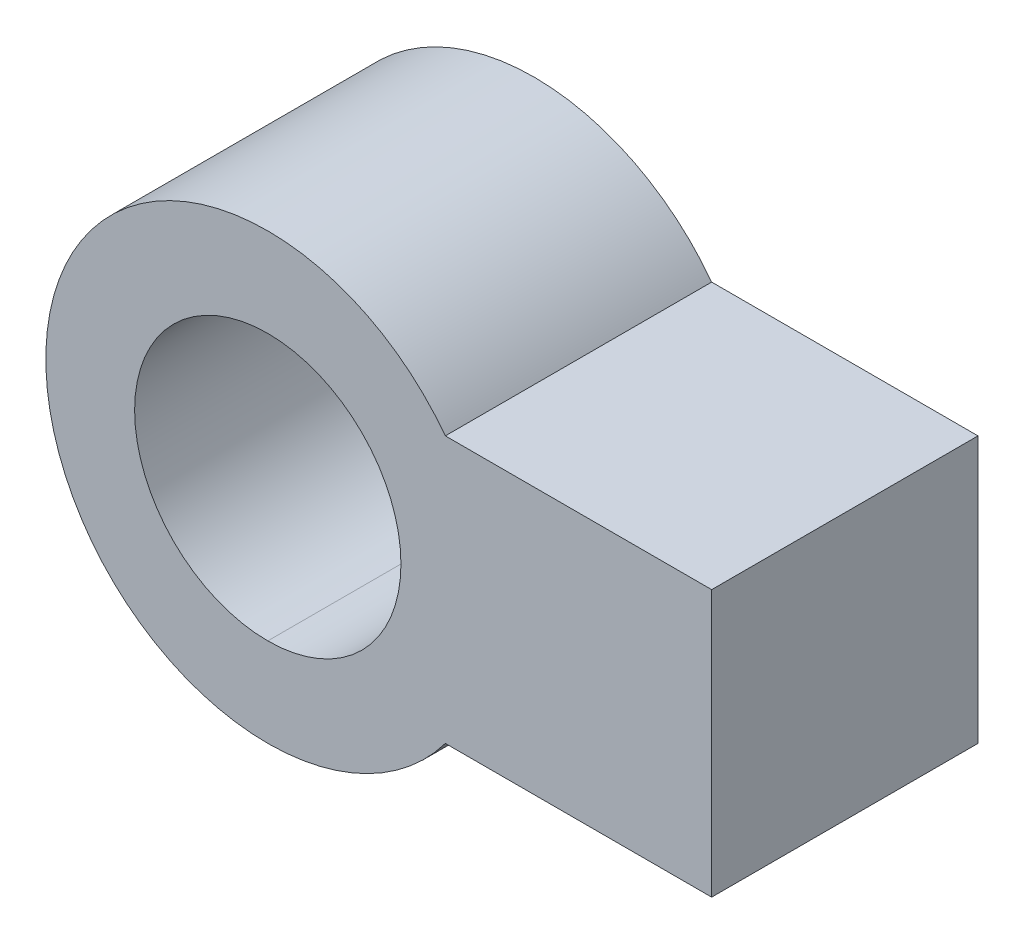
ISO-10303-21;
HEADER;
FILE_DESCRIPTION(('STEP AP214'),'2;1');
FILE_NAME('part.step','',(''),(''),'','','');
FILE_SCHEMA(('AUTOMOTIVE_DESIGN { 1 0 10303 214 1 1 1 1 }'));
ENDSEC;
DATA;
#1=APPLICATION_CONTEXT('core data for automotive mechanical design processes');
#2=APPLICATION_PROTOCOL_DEFINITION('international standard','automotive_design',2000,#1);
#3=PRODUCT_CONTEXT('',#1,'mechanical');
#4=PRODUCT('Part','Part','',(#3));
#5=PRODUCT_RELATED_PRODUCT_CATEGORY('part','',(#4));
#6=PRODUCT_DEFINITION_FORMATION('','',#4);
#7=PRODUCT_DEFINITION_CONTEXT('part definition',#1,'design');
#8=PRODUCT_DEFINITION('design','',#6,#7);
#9=PRODUCT_DEFINITION_SHAPE('','',#8);
#10=(LENGTH_UNIT() NAMED_UNIT(*) SI_UNIT(.MILLI.,.METRE.));
#11=(NAMED_UNIT(*) PLANE_ANGLE_UNIT() SI_UNIT($,.RADIAN.));
#12=(NAMED_UNIT(*) SI_UNIT($,.STERADIAN.) SOLID_ANGLE_UNIT());
#13=UNCERTAINTY_MEASURE_WITH_UNIT(LENGTH_MEASURE(1.E-05),#10,'distance_accuracy_value','');
#14=(GEOMETRIC_REPRESENTATION_CONTEXT(3) GLOBAL_UNCERTAINTY_ASSIGNED_CONTEXT((#13)) GLOBAL_UNIT_ASSIGNED_CONTEXT((#10,
#11,#12)) REPRESENTATION_CONTEXT('',''));
#15=CARTESIAN_POINT('',(0.,0.,0.));
#16=DIRECTION('',(0.,0.,1.));
#17=DIRECTION('',(1.,0.,0.));
#18=AXIS2_PLACEMENT_3D('',#15,#16,#17);
#19=CARTESIAN_POINT('',(0.,0.,6.));
#20=DIRECTION('',(0.,0.,1.));
#21=DIRECTION('',(1.,0.,0.));
#22=AXIS2_PLACEMENT_3D('',#19,#20,#21);
#23=PLANE('',#22);
#24=CARTESIAN_POINT('',(0.,0.,6.));
#25=DIRECTION('',(0.,0.,1.));
#26=DIRECTION('',(1.,0.,0.));
#27=AXIS2_PLACEMENT_3D('',#24,#25,#26);
#28=CIRCLE('',#27,5.);
#29=CARTESIAN_POINT('',(4.,3.,6.));
#30=VERTEX_POINT('',#29);
#31=CARTESIAN_POINT('',(4.,-3.,6.));
#32=VERTEX_POINT('',#31);
#33=EDGE_CURVE('E159',#30,#32,#28,.T.);
#34=ORIENTED_EDGE('',*,*,#33,.T.);
#35=DIRECTION('',(1.,0.,0.));
#36=VECTOR('',#35,1.);
#37=CARTESIAN_POINT('',(0.,-3.,6.));
#38=LINE('',#37,#36);
#39=CARTESIAN_POINT('',(10.,-3.,6.));
#40=VERTEX_POINT('',#39);
#41=EDGE_CURVE('E107',#32,#40,#38,.T.);
#42=ORIENTED_EDGE('',*,*,#41,.T.);
#43=DIRECTION('',(0.,1.,0.));
#44=VECTOR('',#43,1.);
#45=CARTESIAN_POINT('',(10.,0.,6.));
#46=LINE('',#45,#44);
#47=CARTESIAN_POINT('',(10.,3.,6.));
#48=VERTEX_POINT('',#47);
#49=EDGE_CURVE('E141',#40,#48,#46,.T.);
#50=ORIENTED_EDGE('',*,*,#49,.T.);
#51=DIRECTION('',(1.,0.,0.));
#52=VECTOR('',#51,1.);
#53=CARTESIAN_POINT('',(0.,3.,6.));
#54=LINE('',#53,#52);
#55=EDGE_CURVE('E135',#30,#48,#54,.T.);
#56=ORIENTED_EDGE('',*,*,#55,.F.);
#57=EDGE_LOOP('',(#34,#42,#50,#56));
#58=FACE_BOUND('',#57,.T.);
#59=CARTESIAN_POINT('',(0.,0.,6.));
#60=DIRECTION('',(0.,0.,1.));
#61=DIRECTION('',(1.,0.,0.));
#62=AXIS2_PLACEMENT_3D('',#59,#60,#61);
#63=CIRCLE('',#62,3.);
#64=CARTESIAN_POINT('',(0.,3.,6.));
#65=VERTEX_POINT('',#64);
#66=CARTESIAN_POINT('',(0.,-3.,6.));
#67=VERTEX_POINT('',#66);
#68=EDGE_CURVE('E128',#65,#67,#63,.T.);
#69=ORIENTED_EDGE('',*,*,#68,.F.);
#70=CARTESIAN_POINT('',(0.,0.,6.));
#71=DIRECTION('',(0.,0.,1.));
#72=DIRECTION('',(1.,0.,0.));
#73=AXIS2_PLACEMENT_3D('',#70,#71,#72);
#74=CIRCLE('',#73,3.);
#75=EDGE_CURVE('E116',#67,#65,#74,.T.);
#76=ORIENTED_EDGE('',*,*,#75,.F.);
#77=EDGE_LOOP('',(#69,#76));
#78=FACE_BOUND('',#77,.T.);
#79=ADVANCED_FACE('F56',(#58,#78),#23,.T.);
#80=CARTESIAN_POINT('',(0.,0.,0.));
#81=DIRECTION('',(0.,0.,1.));
#82=DIRECTION('',(1.,0.,0.));
#83=AXIS2_PLACEMENT_3D('',#80,#81,#82);
#84=PLANE('',#83);
#85=CARTESIAN_POINT('',(0.,0.,0.));
#86=DIRECTION('',(0.,0.,1.));
#87=DIRECTION('',(1.,0.,0.));
#88=AXIS2_PLACEMENT_3D('',#85,#86,#87);
#89=CIRCLE('',#88,5.);
#90=CARTESIAN_POINT('',(4.,3.,0.));
#91=VERTEX_POINT('',#90);
#92=CARTESIAN_POINT('',(4.,-3.,0.));
#93=VERTEX_POINT('',#92);
#94=EDGE_CURVE('E123',#91,#93,#89,.T.);
#95=ORIENTED_EDGE('',*,*,#94,.F.);
#96=DIRECTION('',(1.,0.,0.));
#97=VECTOR('',#96,1.);
#98=CARTESIAN_POINT('',(0.,3.,0.));
#99=LINE('',#98,#97);
#100=CARTESIAN_POINT('',(10.,3.,0.));
#101=VERTEX_POINT('',#100);
#102=EDGE_CURVE('E154',#91,#101,#99,.T.);
#103=ORIENTED_EDGE('',*,*,#102,.T.);
#104=DIRECTION('',(0.,1.,0.));
#105=VECTOR('',#104,1.);
#106=CARTESIAN_POINT('',(10.,0.,0.));
#107=LINE('',#106,#105);
#108=CARTESIAN_POINT('',(10.,-3.,0.));
#109=VERTEX_POINT('',#108);
#110=EDGE_CURVE('E150',#109,#101,#107,.T.);
#111=ORIENTED_EDGE('',*,*,#110,.F.);
#112=DIRECTION('',(1.,0.,0.));
#113=VECTOR('',#112,1.);
#114=CARTESIAN_POINT('',(0.,-3.,0.));
#115=LINE('',#114,#113);
#116=EDGE_CURVE('E147',#93,#109,#115,.T.);
#117=ORIENTED_EDGE('',*,*,#116,.F.);
#118=EDGE_LOOP('',(#95,#103,#111,#117));
#119=FACE_BOUND('',#118,.T.);
#120=CARTESIAN_POINT('',(0.,0.,0.));
#121=DIRECTION('',(0.,0.,1.));
#122=DIRECTION('',(1.,0.,0.));
#123=AXIS2_PLACEMENT_3D('',#120,#121,#122);
#124=CIRCLE('',#123,3.);
#125=CARTESIAN_POINT('',(0.,3.,0.));
#126=VERTEX_POINT('',#125);
#127=CARTESIAN_POINT('',(0.,-3.,0.));
#128=VERTEX_POINT('',#127);
#129=EDGE_CURVE('E12',#126,#128,#124,.F.);
#130=ORIENTED_EDGE('',*,*,#129,.F.);
#131=CARTESIAN_POINT('',(0.,0.,0.));
#132=DIRECTION('',(0.,0.,1.));
#133=DIRECTION('',(1.,0.,0.));
#134=AXIS2_PLACEMENT_3D('',#131,#132,#133);
#135=CIRCLE('',#134,3.);
#136=EDGE_CURVE('E130',#126,#128,#135,.T.);
#137=ORIENTED_EDGE('',*,*,#136,.T.);
#138=EDGE_LOOP('',(#130,#137));
#139=FACE_BOUND('',#138,.T.);
#140=ADVANCED_FACE('F172',(#119,#139),#84,.F.);
#141=CARTESIAN_POINT('',(0.,0.,6.));
#142=DIRECTION('',(0.,0.,-1.));
#143=DIRECTION('',(-1.,0.,0.));
#144=AXIS2_PLACEMENT_3D('',#141,#142,#143);
#145=CYLINDRICAL_SURFACE('',#144,5.);
#146=ORIENTED_EDGE('',*,*,#94,.T.);
#147=DIRECTION('',(0.,0.,-1.));
#148=VECTOR('',#147,1.);
#149=CARTESIAN_POINT('',(4.,-3.,6.));
#150=LINE('',#149,#148);
#151=EDGE_CURVE('E132',#32,#93,#150,.T.);
#152=ORIENTED_EDGE('',*,*,#151,.F.);
#153=ORIENTED_EDGE('',*,*,#33,.F.);
#154=DIRECTION('',(0.,0.,-1.));
#155=VECTOR('',#154,1.);
#156=CARTESIAN_POINT('',(4.,3.,6.));
#157=LINE('',#156,#155);
#158=EDGE_CURVE('E74',#30,#91,#157,.T.);
#159=ORIENTED_EDGE('',*,*,#158,.T.);
#160=EDGE_LOOP('',(#146,#152,#153,#159));
#161=FACE_BOUND('',#160,.T.);
#162=ADVANCED_FACE('F58',(#161),#145,.T.);
#163=CARTESIAN_POINT('',(0.,-3.,6.));
#164=DIRECTION('',(0.,1.,0.));
#165=DIRECTION('',(0.,0.,1.));
#166=AXIS2_PLACEMENT_3D('',#163,#164,#165);
#167=PLANE('',#166);
#168=ORIENTED_EDGE('',*,*,#116,.T.);
#169=DIRECTION('',(0.,0.,-1.));
#170=VECTOR('',#169,1.);
#171=CARTESIAN_POINT('',(10.,-3.,6.));
#172=LINE('',#171,#170);
#173=EDGE_CURVE('E165',#40,#109,#172,.T.);
#174=ORIENTED_EDGE('',*,*,#173,.F.);
#175=ORIENTED_EDGE('',*,*,#41,.F.);
#176=ORIENTED_EDGE('',*,*,#151,.T.);
#177=EDGE_LOOP('',(#168,#174,#175,#176));
#178=FACE_BOUND('',#177,.T.);
#179=ADVANCED_FACE('F170',(#178),#167,.F.);
#180=CARTESIAN_POINT('',(10.,0.,6.));
#181=DIRECTION('',(-1.,0.,0.));
#182=DIRECTION('',(0.,0.,1.));
#183=AXIS2_PLACEMENT_3D('',#180,#181,#182);
#184=PLANE('',#183);
#185=ORIENTED_EDGE('',*,*,#110,.T.);
#186=DIRECTION('',(0.,0.,-1.));
#187=VECTOR('',#186,1.);
#188=CARTESIAN_POINT('',(10.,3.,6.));
#189=LINE('',#188,#187);
#190=EDGE_CURVE('E139',#48,#101,#189,.T.);
#191=ORIENTED_EDGE('',*,*,#190,.F.);
#192=ORIENTED_EDGE('',*,*,#49,.F.);
#193=ORIENTED_EDGE('',*,*,#173,.T.);
#194=EDGE_LOOP('',(#185,#191,#192,#193));
#195=FACE_BOUND('',#194,.T.);
#196=ADVANCED_FACE('F180',(#195),#184,.F.);
#197=CARTESIAN_POINT('',(0.,3.,6.));
#198=DIRECTION('',(0.,1.,0.));
#199=DIRECTION('',(0.,0.,1.));
#200=AXIS2_PLACEMENT_3D('',#197,#198,#199);
#201=PLANE('',#200);
#202=ORIENTED_EDGE('',*,*,#102,.F.);
#203=ORIENTED_EDGE('',*,*,#158,.F.);
#204=ORIENTED_EDGE('',*,*,#55,.T.);
#205=ORIENTED_EDGE('',*,*,#190,.T.);
#206=EDGE_LOOP('',(#202,#203,#204,#205));
#207=FACE_BOUND('',#206,.T.);
#208=ADVANCED_FACE('F175',(#207),#201,.T.);
#209=CARTESIAN_POINT('',(0.,0.,6.));
#210=DIRECTION('',(0.,0.,-1.));
#211=DIRECTION('',(-1.,0.,0.));
#212=AXIS2_PLACEMENT_3D('',#209,#210,#211);
#213=CYLINDRICAL_SURFACE('',#212,3.);
#214=ORIENTED_EDGE('',*,*,#136,.F.);
#215=DIRECTION('',(0.,0.,-1.));
#216=VECTOR('',#215,1.);
#217=CARTESIAN_POINT('',(0.,3.,6.));
#218=LINE('',#217,#216);
#219=EDGE_CURVE('E99',#65,#126,#218,.T.);
#220=ORIENTED_EDGE('',*,*,#219,.F.);
#221=ORIENTED_EDGE('',*,*,#68,.T.);
#222=DIRECTION('',(0.,0.,-1.));
#223=VECTOR('',#222,1.);
#224=CARTESIAN_POINT('',(0.,-3.,6.));
#225=LINE('',#224,#223);
#226=EDGE_CURVE('E66',#67,#128,#225,.T.);
#227=ORIENTED_EDGE('',*,*,#226,.T.);
#228=EDGE_LOOP('',(#214,#220,#221,#227));
#229=FACE_BOUND('',#228,.T.);
#230=ADVANCED_FACE('F127',(#229),#213,.F.);
#231=CARTESIAN_POINT('',(0.,0.,6.));
#232=DIRECTION('',(0.,0.,-1.));
#233=DIRECTION('',(-1.,0.,0.));
#234=AXIS2_PLACEMENT_3D('',#231,#232,#233);
#235=CYLINDRICAL_SURFACE('',#234,3.);
#236=ORIENTED_EDGE('',*,*,#129,.T.);
#237=ORIENTED_EDGE('',*,*,#226,.F.);
#238=ORIENTED_EDGE('',*,*,#75,.T.);
#239=ORIENTED_EDGE('',*,*,#219,.T.);
#240=EDGE_LOOP('',(#236,#237,#238,#239));
#241=FACE_BOUND('',#240,.T.);
#242=ADVANCED_FACE('F117',(#241),#235,.F.);
#243=CLOSED_SHELL('',(#79,#140,#162,#179,#196,#208,#230,#242));
#244=MANIFOLD_SOLID_BREP('B2',#243);
#245=ADVANCED_BREP_SHAPE_REPRESENTATION('',(#18,#244),#14);
#246=SHAPE_DEFINITION_REPRESENTATION(#9,#245);
ENDSEC;
END-ISO-10303-21;
